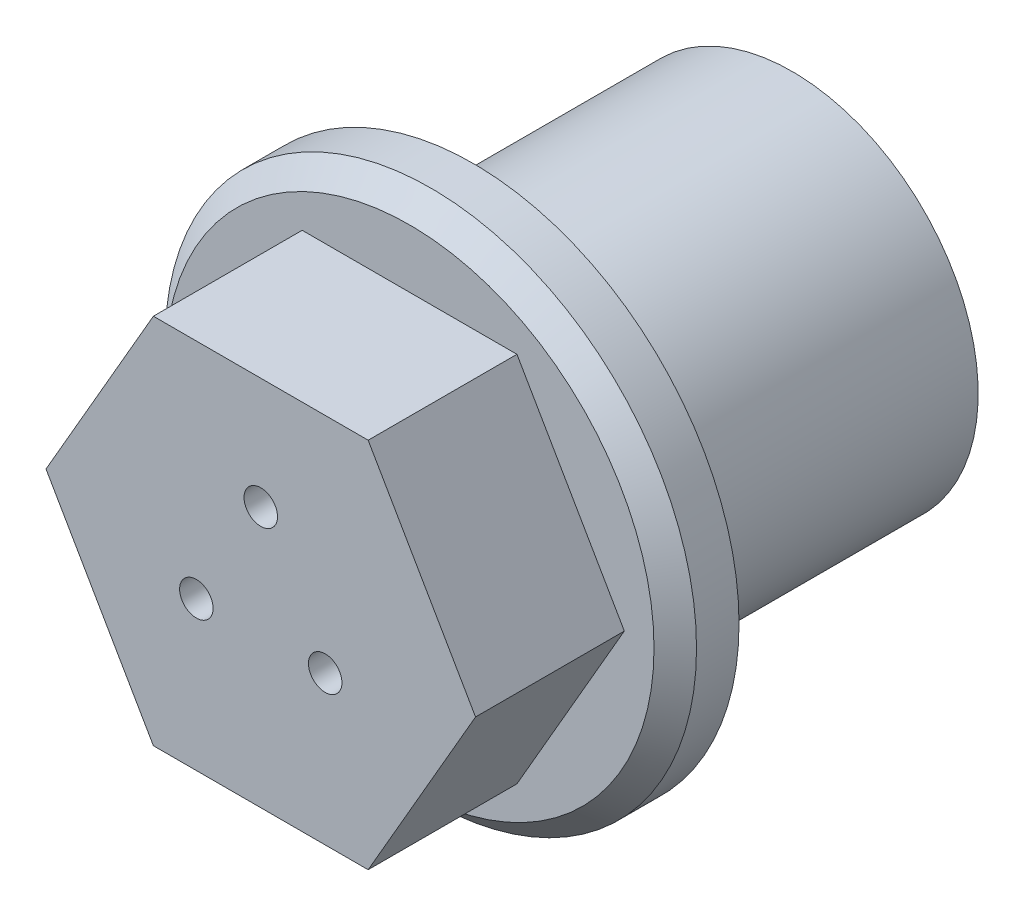
ISO-10303-21;
HEADER;
FILE_DESCRIPTION(('STEP AP214'),'2;1');
FILE_NAME('part.step','',(''),(''),'','','');
FILE_SCHEMA(('AUTOMOTIVE_DESIGN { 1 0 10303 214 1 1 1 1 }'));
ENDSEC;
DATA;
#1=APPLICATION_CONTEXT('core data for automotive mechanical design processes');
#2=APPLICATION_PROTOCOL_DEFINITION('international standard','automotive_design',2000,#1);
#3=PRODUCT_CONTEXT('',#1,'mechanical');
#4=PRODUCT('Part','Part','',(#3));
#5=PRODUCT_RELATED_PRODUCT_CATEGORY('part','',(#4));
#6=PRODUCT_DEFINITION_FORMATION('','',#4);
#7=PRODUCT_DEFINITION_CONTEXT('part definition',#1,'design');
#8=PRODUCT_DEFINITION('design','',#6,#7);
#9=PRODUCT_DEFINITION_SHAPE('','',#8);
#10=(LENGTH_UNIT() NAMED_UNIT(*) SI_UNIT(.MILLI.,.METRE.));
#11=(NAMED_UNIT(*) PLANE_ANGLE_UNIT() SI_UNIT($,.RADIAN.));
#12=(NAMED_UNIT(*) SI_UNIT($,.STERADIAN.) SOLID_ANGLE_UNIT());
#13=UNCERTAINTY_MEASURE_WITH_UNIT(LENGTH_MEASURE(1.E-05),#10,'distance_accuracy_value','');
#14=(GEOMETRIC_REPRESENTATION_CONTEXT(3) GLOBAL_UNCERTAINTY_ASSIGNED_CONTEXT((#13)) GLOBAL_UNIT_ASSIGNED_CONTEXT((#10,
#11,#12)) REPRESENTATION_CONTEXT('',''));
#15=CARTESIAN_POINT('',(0.,0.,0.));
#16=DIRECTION('',(0.,0.,1.));
#17=DIRECTION('',(1.,0.,0.));
#18=AXIS2_PLACEMENT_3D('',#15,#16,#17);
#19=CARTESIAN_POINT('',(0.,0.,31.75));
#20=DIRECTION('',(0.,0.,-1.));
#21=DIRECTION('',(-1.,0.,0.));
#22=AXIS2_PLACEMENT_3D('',#19,#20,#21);
#23=CYLINDRICAL_SURFACE('',#22,15.875);
#24=CARTESIAN_POINT('',(0.,0.,21.59));
#25=DIRECTION('',(0.,0.,1.));
#26=DIRECTION('',(1.,0.,0.));
#27=AXIS2_PLACEMENT_3D('',#24,#25,#26);
#28=CIRCLE('',#27,15.875);
#29=CARTESIAN_POINT('',(15.875,0.,21.59));
#30=VERTEX_POINT('',#29);
#31=EDGE_CURVE('E12',#30,#30,#28,.F.);
#32=ORIENTED_EDGE('',*,*,#31,.T.);
#33=EDGE_LOOP('',(#32));
#34=FACE_BOUND('',#33,.T.);
#35=CARTESIAN_POINT('',(0.,0.,19.05));
#36=DIRECTION('',(0.,0.,1.));
#37=DIRECTION('',(1.,0.,0.));
#38=AXIS2_PLACEMENT_3D('',#35,#36,#37);
#39=CIRCLE('',#38,15.875);
#40=CARTESIAN_POINT('',(15.875,0.,19.05));
#41=VERTEX_POINT('',#40);
#42=EDGE_CURVE('E205',#41,#41,#39,.T.);
#43=ORIENTED_EDGE('',*,*,#42,.T.);
#44=EDGE_LOOP('',(#43));
#45=FACE_BOUND('',#44,.T.);
#46=ADVANCED_FACE('F35',(#34,#45),#23,.T.);
#47=CARTESIAN_POINT('',(0.,0.,19.05));
#48=DIRECTION('',(0.,0.,-1.));
#49=DIRECTION('',(-1.,0.,0.));
#50=AXIS2_PLACEMENT_3D('',#47,#48,#49);
#51=CYLINDRICAL_SURFACE('',#50,11.1125);
#52=CARTESIAN_POINT('',(0.,0.,19.05));
#53=DIRECTION('',(0.,0.,1.));
#54=DIRECTION('',(1.,0.,0.));
#55=AXIS2_PLACEMENT_3D('',#52,#53,#54);
#56=CIRCLE('',#55,11.1125);
#57=CARTESIAN_POINT('',(-11.1125,0.,19.05));
#58=VERTEX_POINT('',#57);
#59=EDGE_CURVE('E220',#58,#58,#56,.T.);
#60=CARTESIAN_POINT('',(0.,0.,0.));
#61=DIRECTION('',(0.,0.,1.));
#62=DIRECTION('',(1.,0.,0.));
#63=AXIS2_PLACEMENT_3D('',#60,#61,#62);
#64=CIRCLE('',#63,11.1125);
#65=CARTESIAN_POINT('',(-11.1125,0.,0.));
#66=VERTEX_POINT('',#65);
#67=EDGE_CURVE('E219',#66,#66,#64,.T.);
#68=CARTESIAN_POINT('',(-11.1125,0.,19.05));
#69=CARTESIAN_POINT('',(-11.1125,0.,18.8515625));
#70=CARTESIAN_POINT('',(-11.1125,0.,18.653125));
#71=CARTESIAN_POINT('',(-11.1125,0.,18.25625));
#72=CARTESIAN_POINT('',(-11.1125,0.,18.0578125));
#73=CARTESIAN_POINT('',(-11.1125,0.,17.6609375));
#74=CARTESIAN_POINT('',(-11.1125,0.,17.4625));
#75=CARTESIAN_POINT('',(-11.1125,0.,17.065625));
#76=CARTESIAN_POINT('',(-11.1125,0.,16.8671875));
#77=CARTESIAN_POINT('',(-11.1125,0.,16.4703125));
#78=CARTESIAN_POINT('',(-11.1125,0.,16.271875));
#79=CARTESIAN_POINT('',(-11.1125,0.,15.875));
#80=CARTESIAN_POINT('',(-11.1125,0.,15.6765625));
#81=CARTESIAN_POINT('',(-11.1125,0.,15.2796875));
#82=CARTESIAN_POINT('',(-11.1125,0.,15.08125));
#83=CARTESIAN_POINT('',(-11.1125,0.,14.684375));
#84=CARTESIAN_POINT('',(-11.1125,0.,14.4859375));
#85=CARTESIAN_POINT('',(-11.1125,0.,14.0890625));
#86=CARTESIAN_POINT('',(-11.1125,0.,13.890625));
#87=CARTESIAN_POINT('',(-11.1125,0.,13.49375));
#88=CARTESIAN_POINT('',(-11.1125,0.,13.2953125));
#89=CARTESIAN_POINT('',(-11.1125,0.,12.8984375));
#90=CARTESIAN_POINT('',(-11.1125,0.,12.7));
#91=CARTESIAN_POINT('',(-11.1125,0.,12.303125));
#92=CARTESIAN_POINT('',(-11.1125,0.,12.1046875));
#93=CARTESIAN_POINT('',(-11.1125,0.,11.7078125));
#94=CARTESIAN_POINT('',(-11.1125,0.,11.509375));
#95=CARTESIAN_POINT('',(-11.1125,0.,11.1125));
#96=CARTESIAN_POINT('',(-11.1125,0.,10.9140625));
#97=CARTESIAN_POINT('',(-11.1125,0.,10.5171875));
#98=CARTESIAN_POINT('',(-11.1125,0.,10.31875));
#99=CARTESIAN_POINT('',(-11.1125,0.,9.921875));
#100=CARTESIAN_POINT('',(-11.1125,0.,9.7234375));
#101=CARTESIAN_POINT('',(-11.1125,0.,9.3265625));
#102=CARTESIAN_POINT('',(-11.1125,0.,9.128125));
#103=CARTESIAN_POINT('',(-11.1125,0.,8.73125));
#104=CARTESIAN_POINT('',(-11.1125,0.,8.5328125));
#105=CARTESIAN_POINT('',(-11.1125,0.,8.1359375));
#106=CARTESIAN_POINT('',(-11.1125,0.,7.9375));
#107=CARTESIAN_POINT('',(-11.1125,0.,7.540625));
#108=CARTESIAN_POINT('',(-11.1125,0.,7.3421875));
#109=CARTESIAN_POINT('',(-11.1125,0.,6.9453125));
#110=CARTESIAN_POINT('',(-11.1125,0.,6.746875));
#111=CARTESIAN_POINT('',(-11.1125,0.,6.35));
#112=CARTESIAN_POINT('',(-11.1125,0.,6.1515625));
#113=CARTESIAN_POINT('',(-11.1125,0.,5.7546875));
#114=CARTESIAN_POINT('',(-11.1125,0.,5.55625));
#115=CARTESIAN_POINT('',(-11.1125,0.,5.159375));
#116=CARTESIAN_POINT('',(-11.1125,0.,4.9609375));
#117=CARTESIAN_POINT('',(-11.1125,0.,4.5640625));
#118=CARTESIAN_POINT('',(-11.1125,0.,4.365625));
#119=CARTESIAN_POINT('',(-11.1125,0.,3.96875));
#120=CARTESIAN_POINT('',(-11.1125,0.,3.7703125));
#121=CARTESIAN_POINT('',(-11.1125,0.,3.3734375));
#122=CARTESIAN_POINT('',(-11.1125,0.,3.175));
#123=CARTESIAN_POINT('',(-11.1125,0.,2.778125));
#124=CARTESIAN_POINT('',(-11.1125,0.,2.5796875));
#125=CARTESIAN_POINT('',(-11.1125,0.,2.1828125));
#126=CARTESIAN_POINT('',(-11.1125,0.,1.984375));
#127=CARTESIAN_POINT('',(-11.1125,0.,1.5875));
#128=CARTESIAN_POINT('',(-11.1125,0.,1.3890625));
#129=CARTESIAN_POINT('',(-11.1125,0.,0.992187500000001));
#130=CARTESIAN_POINT('',(-11.1125,0.,0.793750000000001));
#131=CARTESIAN_POINT('',(-11.1125,0.,0.396875));
#132=CARTESIAN_POINT('',(-11.1125,0.,0.1984375));
#133=CARTESIAN_POINT('',(-11.1125,0.,0.));
#134=B_SPLINE_CURVE_WITH_KNOTS('',3,(#68,#69,#70,#71,#72,#73,#74,#75,#76,#77,#78,#79,#80,#81,
#82,#83,#84,#85,#86,#87,#88,#89,#90,#91,#92,#93,#94,#95,#96,#97,#98,#99,#100,#101,#102,#103,
#104,#105,#106,#107,#108,#109,#110,#111,#112,#113,#114,#115,#116,#117,#118,#119,#120,#121,#122,
#123,#124,#125,#126,#127,#128,#129,#130,#131,#132,#133),.UNSPECIFIED.,.F.,.F.,(4,2,2,2,2,2,2,2,
2,2,2,2,2,2,2,2,2,2,2,2,2,2,2,2,2,2,2,2,2,2,2,2,4),(0.,0.5953125,1.190625,1.7859375,2.38125,
2.9765625,3.571875,4.1671875,4.7625,5.3578125,5.953125,6.5484375,7.14375,7.7390625,8.334375,
8.9296875,9.525,10.1203125,10.715625,11.3109375,11.90625,12.5015625,13.096875,13.6921875,
14.2875,14.8828125,15.478125,16.0734375,16.66875,17.2640625,17.859375,18.4546875,19.05),.UNSPECIFIED.);
#135=EDGE_CURVE('BSEAM242',#58,#66,#134,.T.);
#136=ORIENTED_EDGE('',*,*,#59,.F.);
#137=ORIENTED_EDGE('',*,*,#67,.T.);
#138=ORIENTED_EDGE('',*,*,#135,.T.);
#139=ORIENTED_EDGE('',*,*,#135,.F.);
#140=EDGE_LOOP('',(#136,#138,#137,#139));
#141=FACE_BOUND('',#140,.T.);
#142=ADVANCED_FACE('F242',(#141),#51,.T.);
#143=CARTESIAN_POINT('',(0.,0.,0.));
#144=DIRECTION('',(0.,0.,1.));
#145=DIRECTION('',(1.,0.,0.));
#146=AXIS2_PLACEMENT_3D('',#143,#144,#145);
#147=PLANE('',#146);
#148=CARTESIAN_POINT('',(0.,0.,0.));
#149=DIRECTION('',(0.,0.,-1.));
#150=DIRECTION('',(-1.,0.,0.));
#151=AXIS2_PLACEMENT_3D('',#148,#149,#150);
#152=CIRCLE('',#151,9.5504);
#153=CARTESIAN_POINT('',(-9.5504,0.,0.));
#154=VERTEX_POINT('',#153);
#155=EDGE_CURVE('E106',#154,#154,#152,.T.);
#156=ORIENTED_EDGE('',*,*,#155,.F.);
#157=EDGE_LOOP('',(#156));
#158=FACE_BOUND('',#157,.T.);
#159=ORIENTED_EDGE('',*,*,#67,.F.);
#160=EDGE_LOOP('',(#159));
#161=FACE_BOUND('',#160,.T.);
#162=ADVANCED_FACE('F248',(#158,#161),#147,.F.);
#163=CARTESIAN_POINT('',(0.,0.,19.05));
#164=DIRECTION('',(0.,0.,1.));
#165=DIRECTION('',(1.,0.,0.));
#166=AXIS2_PLACEMENT_3D('',#163,#164,#165);
#167=PLANE('',#166);
#168=ORIENTED_EDGE('',*,*,#59,.T.);
#169=EDGE_LOOP('',(#168));
#170=FACE_BOUND('',#169,.T.);
#171=ORIENTED_EDGE('',*,*,#42,.F.);
#172=EDGE_LOOP('',(#171));
#173=FACE_BOUND('',#172,.T.);
#174=ADVANCED_FACE('F253',(#170,#173),#167,.F.);
#175=CARTESIAN_POINT('',(0.,0.,22.86));
#176=DIRECTION('',(0.,0.,1.));
#177=DIRECTION('',(1.,0.,0.));
#178=AXIS2_PLACEMENT_3D('',#175,#176,#177);
#179=PLANE('',#178);
#180=CARTESIAN_POINT('',(0.,0.,22.86));
#181=DIRECTION('',(0.,0.,1.));
#182=DIRECTION('',(1.,0.,0.));
#183=AXIS2_PLACEMENT_3D('',#180,#181,#182);
#184=CIRCLE('',#183,14.605);
#185=CARTESIAN_POINT('',(14.605,0.,22.86));
#186=VERTEX_POINT('',#185);
#187=EDGE_CURVE('E46',#186,#186,#184,.T.);
#188=ORIENTED_EDGE('',*,*,#187,.T.);
#189=EDGE_LOOP('',(#188));
#190=FACE_BOUND('',#189,.T.);
#191=DIRECTION('',(1.,0.,0.));
#192=VECTOR('',#191,1.);
#193=CARTESIAN_POINT('',(-6.41580486636972,-11.1125,22.86));
#194=LINE('',#193,#192);
#195=CARTESIAN_POINT('',(-6.41580486636972,-11.1125,22.86));
#196=VERTEX_POINT('',#195);
#197=CARTESIAN_POINT('',(6.41580486636972,-11.1125,22.86));
#198=VERTEX_POINT('',#197);
#199=EDGE_CURVE('E190',#196,#198,#194,.T.);
#200=ORIENTED_EDGE('',*,*,#199,.F.);
#201=DIRECTION('',(0.5,-0.866025403784439,0.));
#202=VECTOR('',#201,1.);
#203=CARTESIAN_POINT('',(-12.8316097327394,0.,22.86));
#204=LINE('',#203,#202);
#205=CARTESIAN_POINT('',(-12.8316097327394,0.,22.86));
#206=VERTEX_POINT('',#205);
#207=EDGE_CURVE('E305',#206,#196,#204,.T.);
#208=ORIENTED_EDGE('',*,*,#207,.F.);
#209=DIRECTION('',(-0.5,-0.866025403784439,0.));
#210=VECTOR('',#209,1.);
#211=CARTESIAN_POINT('',(-6.41580486636972,11.1125,22.86));
#212=LINE('',#211,#210);
#213=CARTESIAN_POINT('',(-6.41580486636972,11.1125,22.86));
#214=VERTEX_POINT('',#213);
#215=EDGE_CURVE('E303',#214,#206,#212,.T.);
#216=ORIENTED_EDGE('',*,*,#215,.F.);
#217=DIRECTION('',(-1.,0.,0.));
#218=VECTOR('',#217,1.);
#219=CARTESIAN_POINT('',(6.41580486636971,11.1125,22.86));
#220=LINE('',#219,#218);
#221=CARTESIAN_POINT('',(6.41580486636971,11.1125,22.86));
#222=VERTEX_POINT('',#221);
#223=EDGE_CURVE('E306',#222,#214,#220,.T.);
#224=ORIENTED_EDGE('',*,*,#223,.F.);
#225=DIRECTION('',(-0.5,0.866025403784438,0.));
#226=VECTOR('',#225,1.);
#227=CARTESIAN_POINT('',(12.8316097327394,0.,22.86));
#228=LINE('',#227,#226);
#229=CARTESIAN_POINT('',(12.8316097327394,0.,22.86));
#230=VERTEX_POINT('',#229);
#231=EDGE_CURVE('E308',#230,#222,#228,.T.);
#232=ORIENTED_EDGE('',*,*,#231,.F.);
#233=DIRECTION('',(0.5,0.866025403784439,0.));
#234=VECTOR('',#233,1.);
#235=CARTESIAN_POINT('',(6.41580486636972,-11.1125,22.86));
#236=LINE('',#235,#234);
#237=EDGE_CURVE('E173',#198,#230,#236,.T.);
#238=ORIENTED_EDGE('',*,*,#237,.F.);
#239=EDGE_LOOP('',(#200,#208,#216,#224,#232,#238));
#240=FACE_BOUND('',#239,.T.);
#241=ADVANCED_FACE('F228',(#190,#240),#179,.T.);
#242=CARTESIAN_POINT('',(6.41580486636972,-11.1125,22.86));
#243=DIRECTION('',(0.866025403784439,-0.5,0.));
#244=DIRECTION('',(0.5,0.866025403784439,0.));
#245=AXIS2_PLACEMENT_3D('',#242,#243,#244);
#246=PLANE('',#245);
#247=DIRECTION('',(0.5,0.866025403784439,0.));
#248=VECTOR('',#247,1.);
#249=CARTESIAN_POINT('',(6.41580486636972,-11.1125,31.75));
#250=LINE('',#249,#248);
#251=CARTESIAN_POINT('',(6.41580486636972,-11.1125,31.75));
#252=VERTEX_POINT('',#251);
#253=CARTESIAN_POINT('',(12.8316097327394,0.,31.75));
#254=VERTEX_POINT('',#253);
#255=EDGE_CURVE('E179',#252,#254,#250,.T.);
#256=ORIENTED_EDGE('',*,*,#255,.F.);
#257=DIRECTION('',(0.,0.,1.));
#258=VECTOR('',#257,1.);
#259=CARTESIAN_POINT('',(6.41580486636972,-11.1125,22.86));
#260=LINE('',#259,#258);
#261=EDGE_CURVE('E203',#198,#252,#260,.T.);
#262=ORIENTED_EDGE('',*,*,#261,.F.);
#263=ORIENTED_EDGE('',*,*,#237,.T.);
#264=DIRECTION('',(0.,0.,1.));
#265=VECTOR('',#264,1.);
#266=CARTESIAN_POINT('',(12.8316097327394,0.,22.86));
#267=LINE('',#266,#265);
#268=EDGE_CURVE('E215',#230,#254,#267,.T.);
#269=ORIENTED_EDGE('',*,*,#268,.T.);
#270=EDGE_LOOP('',(#256,#262,#263,#269));
#271=FACE_BOUND('',#270,.T.);
#272=ADVANCED_FACE('F268',(#271),#246,.T.);
#273=CARTESIAN_POINT('',(-6.41580486636972,-11.1125,22.86));
#274=DIRECTION('',(0.,-1.,0.));
#275=DIRECTION('',(1.,0.,0.));
#276=AXIS2_PLACEMENT_3D('',#273,#274,#275);
#277=PLANE('',#276);
#278=DIRECTION('',(1.,0.,0.));
#279=VECTOR('',#278,1.);
#280=CARTESIAN_POINT('',(-6.41580486636972,-11.1125,31.75));
#281=LINE('',#280,#279);
#282=CARTESIAN_POINT('',(-6.41580486636972,-11.1125,31.75));
#283=VERTEX_POINT('',#282);
#284=EDGE_CURVE('E201',#283,#252,#281,.T.);
#285=ORIENTED_EDGE('',*,*,#284,.F.);
#286=DIRECTION('',(0.,0.,1.));
#287=VECTOR('',#286,1.);
#288=CARTESIAN_POINT('',(-6.41580486636972,-11.1125,22.86));
#289=LINE('',#288,#287);
#290=EDGE_CURVE('E206',#196,#283,#289,.T.);
#291=ORIENTED_EDGE('',*,*,#290,.F.);
#292=ORIENTED_EDGE('',*,*,#199,.T.);
#293=ORIENTED_EDGE('',*,*,#261,.T.);
#294=EDGE_LOOP('',(#285,#291,#292,#293));
#295=FACE_BOUND('',#294,.T.);
#296=ADVANCED_FACE('F159',(#295),#277,.T.);
#297=CARTESIAN_POINT('',(-12.8316097327394,0.,22.86));
#298=DIRECTION('',(-0.866025403784439,-0.5,0.));
#299=DIRECTION('',(0.5,-0.866025403784439,0.));
#300=AXIS2_PLACEMENT_3D('',#297,#298,#299);
#301=PLANE('',#300);
#302=DIRECTION('',(0.5,-0.866025403784439,0.));
#303=VECTOR('',#302,1.);
#304=CARTESIAN_POINT('',(-12.8316097327394,0.,31.75));
#305=LINE('',#304,#303);
#306=CARTESIAN_POINT('',(-12.8316097327394,0.,31.75));
#307=VERTEX_POINT('',#306);
#308=EDGE_CURVE('E198',#307,#283,#305,.T.);
#309=ORIENTED_EDGE('',*,*,#308,.F.);
#310=DIRECTION('',(0.,0.,1.));
#311=VECTOR('',#310,1.);
#312=CARTESIAN_POINT('',(-12.8316097327394,0.,22.86));
#313=LINE('',#312,#311);
#314=EDGE_CURVE('E208',#206,#307,#313,.T.);
#315=ORIENTED_EDGE('',*,*,#314,.F.);
#316=ORIENTED_EDGE('',*,*,#207,.T.);
#317=ORIENTED_EDGE('',*,*,#290,.T.);
#318=EDGE_LOOP('',(#309,#315,#316,#317));
#319=FACE_BOUND('',#318,.T.);
#320=ADVANCED_FACE('F288',(#319),#301,.T.);
#321=CARTESIAN_POINT('',(-6.41580486636972,11.1125,22.86));
#322=DIRECTION('',(-0.866025403784439,0.5,0.));
#323=DIRECTION('',(-0.5,-0.866025403784439,0.));
#324=AXIS2_PLACEMENT_3D('',#321,#322,#323);
#325=PLANE('',#324);
#326=DIRECTION('',(-0.5,-0.866025403784439,0.));
#327=VECTOR('',#326,1.);
#328=CARTESIAN_POINT('',(-6.41580486636972,11.1125,31.75));
#329=LINE('',#328,#327);
#330=CARTESIAN_POINT('',(-6.41580486636972,11.1125,31.75));
#331=VERTEX_POINT('',#330);
#332=EDGE_CURVE('E195',#331,#307,#329,.T.);
#333=ORIENTED_EDGE('',*,*,#332,.F.);
#334=DIRECTION('',(0.,0.,1.));
#335=VECTOR('',#334,1.);
#336=CARTESIAN_POINT('',(-6.41580486636972,11.1125,22.86));
#337=LINE('',#336,#335);
#338=EDGE_CURVE('E210',#214,#331,#337,.T.);
#339=ORIENTED_EDGE('',*,*,#338,.F.);
#340=ORIENTED_EDGE('',*,*,#215,.T.);
#341=ORIENTED_EDGE('',*,*,#314,.T.);
#342=EDGE_LOOP('',(#333,#339,#340,#341));
#343=FACE_BOUND('',#342,.T.);
#344=ADVANCED_FACE('F285',(#343),#325,.T.);
#345=CARTESIAN_POINT('',(6.41580486636971,11.1125,22.86));
#346=DIRECTION('',(0.,1.,0.));
#347=DIRECTION('',(0.,0.,1.));
#348=AXIS2_PLACEMENT_3D('',#345,#346,#347);
#349=PLANE('',#348);
#350=DIRECTION('',(-1.,0.,0.));
#351=VECTOR('',#350,1.);
#352=CARTESIAN_POINT('',(6.41580486636971,11.1125,31.75));
#353=LINE('',#352,#351);
#354=CARTESIAN_POINT('',(6.41580486636971,11.1125,31.75));
#355=VERTEX_POINT('',#354);
#356=EDGE_CURVE('E187',#355,#331,#353,.T.);
#357=ORIENTED_EDGE('',*,*,#356,.F.);
#358=DIRECTION('',(0.,0.,1.));
#359=VECTOR('',#358,1.);
#360=CARTESIAN_POINT('',(6.41580486636971,11.1125,22.86));
#361=LINE('',#360,#359);
#362=EDGE_CURVE('E212',#222,#355,#361,.T.);
#363=ORIENTED_EDGE('',*,*,#362,.F.);
#364=ORIENTED_EDGE('',*,*,#223,.T.);
#365=ORIENTED_EDGE('',*,*,#338,.T.);
#366=EDGE_LOOP('',(#357,#363,#364,#365));
#367=FACE_BOUND('',#366,.T.);
#368=ADVANCED_FACE('F281',(#367),#349,.T.);
#369=CARTESIAN_POINT('',(12.8316097327394,0.,22.86));
#370=DIRECTION('',(0.866025403784438,0.5,0.));
#371=DIRECTION('',(-0.5,0.866025403784439,0.));
#372=AXIS2_PLACEMENT_3D('',#369,#370,#371);
#373=PLANE('',#372);
#374=DIRECTION('',(-0.5,0.866025403784438,0.));
#375=VECTOR('',#374,1.);
#376=CARTESIAN_POINT('',(12.8316097327394,0.,31.75));
#377=LINE('',#376,#375);
#378=EDGE_CURVE('E181',#254,#355,#377,.T.);
#379=ORIENTED_EDGE('',*,*,#378,.F.);
#380=ORIENTED_EDGE('',*,*,#268,.F.);
#381=ORIENTED_EDGE('',*,*,#231,.T.);
#382=ORIENTED_EDGE('',*,*,#362,.T.);
#383=EDGE_LOOP('',(#379,#380,#381,#382));
#384=FACE_BOUND('',#383,.T.);
#385=ADVANCED_FACE('F237',(#384),#373,.T.);
#386=CARTESIAN_POINT('',(0.,0.,31.75));
#387=DIRECTION('',(0.,0.,1.));
#388=DIRECTION('',(1.,0.,0.));
#389=AXIS2_PLACEMENT_3D('',#386,#387,#388);
#390=PLANE('',#389);
#391=CARTESIAN_POINT('',(0.,4.445,31.75));
#392=DIRECTION('',(0.,0.,1.));
#393=DIRECTION('',(1.,0.,0.));
#394=AXIS2_PLACEMENT_3D('',#391,#392,#393);
#395=CIRCLE('',#394,1.);
#396=CARTESIAN_POINT('',(1.,4.445,31.75));
#397=VERTEX_POINT('',#396);
#398=EDGE_CURVE('E107',#397,#397,#395,.T.);
#399=ORIENTED_EDGE('',*,*,#398,.F.);
#400=EDGE_LOOP('',(#399));
#401=FACE_BOUND('',#400,.T.);
#402=CARTESIAN_POINT('',(3.84948291982211,-2.22249999999983,31.75));
#403=DIRECTION('',(0.,0.,1.));
#404=DIRECTION('',(1.,0.,0.));
#405=AXIS2_PLACEMENT_3D('',#402,#403,#404);
#406=CIRCLE('',#405,1.00000000000024);
#407=CARTESIAN_POINT('',(4.84948291982236,-2.22249999999983,31.75));
#408=VERTEX_POINT('',#407);
#409=EDGE_CURVE('E396',#408,#408,#406,.T.);
#410=ORIENTED_EDGE('',*,*,#409,.F.);
#411=EDGE_LOOP('',(#410));
#412=FACE_BOUND('',#411,.T.);
#413=CARTESIAN_POINT('',(-3.84948291982154,-2.22250000000017,31.75));
#414=DIRECTION('',(0.,0.,1.));
#415=DIRECTION('',(1.,0.,0.));
#416=AXIS2_PLACEMENT_3D('',#413,#414,#415);
#417=CIRCLE('',#416,1.00000000000036);
#418=CARTESIAN_POINT('',(-2.84948291982119,-2.22250000000017,31.75));
#419=VERTEX_POINT('',#418);
#420=EDGE_CURVE('E402',#419,#419,#417,.T.);
#421=ORIENTED_EDGE('',*,*,#420,.F.);
#422=EDGE_LOOP('',(#421));
#423=FACE_BOUND('',#422,.T.);
#424=ORIENTED_EDGE('',*,*,#284,.T.);
#425=ORIENTED_EDGE('',*,*,#255,.T.);
#426=ORIENTED_EDGE('',*,*,#378,.T.);
#427=ORIENTED_EDGE('',*,*,#356,.T.);
#428=ORIENTED_EDGE('',*,*,#332,.T.);
#429=ORIENTED_EDGE('',*,*,#308,.T.);
#430=EDGE_LOOP('',(#424,#425,#426,#427,#428,#429));
#431=FACE_BOUND('',#430,.T.);
#432=ADVANCED_FACE('F232',(#401,#412,#423,#431),#390,.T.);
#433=CARTESIAN_POINT('',(0.,0.,22.86));
#434=DIRECTION('',(0.,0.,-1.));
#435=DIRECTION('',(-1.,0.,0.));
#436=AXIS2_PLACEMENT_3D('',#433,#434,#435);
#437=CONICAL_SURFACE('',#436,14.605,0.785398163397448);
#438=ORIENTED_EDGE('',*,*,#31,.F.);
#439=EDGE_LOOP('',(#438));
#440=FACE_BOUND('',#439,.T.);
#441=ORIENTED_EDGE('',*,*,#187,.F.);
#442=EDGE_LOOP('',(#441));
#443=FACE_BOUND('',#442,.T.);
#444=ADVANCED_FACE('F37',(#440,#443),#437,.T.);
#445=CARTESIAN_POINT('',(0.,0.,22.86));
#446=DIRECTION('',(0.,0.,1.));
#447=DIRECTION('',(1.,0.,0.));
#448=AXIS2_PLACEMENT_3D('',#445,#446,#447);
#449=PLANE('',#448);
#450=CARTESIAN_POINT('',(0.,4.445,22.86));
#451=DIRECTION('',(0.,0.,1.));
#452=DIRECTION('',(1.,0.,0.));
#453=AXIS2_PLACEMENT_3D('',#450,#451,#452);
#454=CIRCLE('',#453,1.);
#455=CARTESIAN_POINT('',(0.000123497343628788,5.44499999236823,22.86));
#456=VERTEX_POINT('',#455);
#457=CARTESIAN_POINT('',(0.,5.445,22.86));
#458=VERTEX_POINT('',#457);
#459=EDGE_CURVE('E100',#456,#458,#454,.F.);
#460=ORIENTED_EDGE('',*,*,#459,.F.);
#461=CARTESIAN_POINT('',(0.,0.,22.86));
#462=DIRECTION('',(0.,0.,1.));
#463=DIRECTION('',(1.,0.,0.));
#464=AXIS2_PLACEMENT_3D('',#461,#462,#463);
#465=CIRCLE('',#464,5.445);
#466=CARTESIAN_POINT('',(4.71552357610018,-2.72247266870399,22.86));
#467=VERTEX_POINT('',#466);
#468=EDGE_CURVE('E119',#467,#456,#465,.T.);
#469=ORIENTED_EDGE('',*,*,#468,.F.);
#470=CARTESIAN_POINT('',(3.84948291982211,-2.22249999999983,22.86));
#471=DIRECTION('',(0.,0.,1.));
#472=DIRECTION('',(1.,0.,0.));
#473=AXIS2_PLACEMENT_3D('',#470,#471,#472);
#474=CIRCLE('',#473,1.00000000000024);
#475=EDGE_CURVE('E59',#467,#467,#474,.F.);
#476=ORIENTED_EDGE('',*,*,#475,.F.);
#477=CARTESIAN_POINT('',(-4.71550300743985,-2.72251631265119,22.86));
#478=VERTEX_POINT('',#477);
#479=EDGE_CURVE('E177',#478,#467,#465,.T.);
#480=ORIENTED_EDGE('',*,*,#479,.F.);
#481=CARTESIAN_POINT('',(-3.84948291982154,-2.22250000000017,22.86));
#482=DIRECTION('',(0.,0.,1.));
#483=DIRECTION('',(1.,0.,0.));
#484=AXIS2_PLACEMENT_3D('',#481,#482,#483);
#485=CIRCLE('',#484,1.00000000000036);
#486=EDGE_CURVE('E115',#478,#478,#485,.F.);
#487=ORIENTED_EDGE('',*,*,#486,.F.);
#488=EDGE_CURVE('E111',#458,#478,#465,.T.);
#489=ORIENTED_EDGE('',*,*,#488,.F.);
#490=EDGE_LOOP('',(#460,#469,#476,#480,#487,#489));
#491=FACE_BOUND('',#490,.T.);
#492=ADVANCED_FACE('F113',(#491),#449,.F.);
#493=CARTESIAN_POINT('',(2.35183173975593,9.25629664757329,0.));
#494=CARTESIAN_POINT('',(2.64410942475608,4.75990654844358,22.86));
#495=CARTESIAN_POINT('',(-16.1607615553907,13.9599601270852,0.));
#496=CARTESIAN_POINT('',(-6.87570367213108,10.0481253979557,22.86));
#497=CARTESIAN_POINT('',(-20.8644250349025,-4.55263316806144,0.));
#498=CARTESIAN_POINT('',(-12.1639225216432,0.528312301068575,22.86));
#499=CARTESIAN_POINT('',(-2.35183173975593,-9.25629664757329,0.));
#500=CARTESIAN_POINT('',(-2.64410942475608,-4.75990654844358,22.86));
#501=CARTESIAN_POINT('',(16.1607615553906,-13.9599601270851,0.));
#502=CARTESIAN_POINT('',(6.87570367213108,-10.0481253979557,22.86));
#503=CARTESIAN_POINT('',(20.8644250349025,4.55263316806143,0.));
#504=CARTESIAN_POINT('',(12.1639225216432,-0.528312301068574,22.86));
#505=CARTESIAN_POINT('',(2.35183173975593,9.25629664757329,0.));
#506=CARTESIAN_POINT('',(2.64410942475608,4.75990654844358,22.86));
#507=(BOUNDED_SURFACE() B_SPLINE_SURFACE(3,1,((#493,#494),(#495,#496),(#497,#498),(#499,#500),
(#501,#502),(#503,#504),(#505,#506)),.UNSPECIFIED.,.T.,.F.,.F.) B_SPLINE_SURFACE_WITH_KNOTS((4,
3,4),(2,2),(0.,0.5,1.),(0.,1.),
.UNSPECIFIED.) GEOMETRIC_REPRESENTATION_ITEM() RATIONAL_B_SPLINE_SURFACE(((1.,1.),
(0.333333333333333,0.333333333333333),(0.333333333333333,0.333333333333333),(1.,1.),
(0.333333333333334,0.333333333333333),(0.333333333333334,0.333333333333333),(1.,1.))) REPRESENTATION_ITEM('') SURFACE());
#508=CARTESIAN_POINT('',(2.64410942475608,4.7599065484436,22.8599999999999));
#509=CARTESIAN_POINT('',(-6.87570367213111,10.0481253979557,22.8599999999999));
#510=CARTESIAN_POINT('',(-12.1639225216433,0.528312301068558,22.8599999999999));
#511=CARTESIAN_POINT('',(-2.64410942475608,-4.7599065484436,22.8599999999999));
#512=CARTESIAN_POINT('',(6.87570367213111,-10.0481253979557,22.8599999999999));
#513=CARTESIAN_POINT('',(12.1639225216433,-0.528312301068557,22.8599999999999));
#514=CARTESIAN_POINT('',(2.64410942475608,4.7599065484436,22.8599999999999));
#515=(BOUNDED_CURVE() B_SPLINE_CURVE(3,(#508,#509,#510,#511,#512,#513,#514),.UNSPECIFIED.,.T.,
.F.) B_SPLINE_CURVE_WITH_KNOTS((4,3,4),(0.,0.5,1.),
.UNSPECIFIED.) CURVE() GEOMETRIC_REPRESENTATION_ITEM() RATIONAL_B_SPLINE_CURVE((1.,
0.333333333333333,0.333333333333333,1.,0.333333333333333,0.333333333333333,1.)) REPRESENTATION_ITEM(''));
#516=EDGE_CURVE('E53',#456,#458,#515,.T.);
#517=ORIENTED_EDGE('',*,*,#155,.T.);
#518=EDGE_LOOP('',(#517));
#519=FACE_BOUND('',#518,.T.);
#520=ORIENTED_EDGE('',*,*,#479,.T.);
#521=ORIENTED_EDGE('',*,*,#468,.T.);
#522=ORIENTED_EDGE('',*,*,#516,.T.);
#523=ORIENTED_EDGE('',*,*,#488,.T.);
#524=EDGE_LOOP('',(#520,#521,#522,#523));
#525=FACE_BOUND('',#524,.T.);
#526=ADVANCED_FACE('F124',(#519,#525),#507,.F.);
#527=CARTESIAN_POINT('',(-3.84948291982154,-2.22250000000017,-0.00101999999999741));
#528=DIRECTION('',(0.,0.,1.));
#529=DIRECTION('',(1.,0.,0.));
#530=AXIS2_PLACEMENT_3D('',#527,#528,#529);
#531=CYLINDRICAL_SURFACE('',#530,1.00000000000036);
#532=ORIENTED_EDGE('',*,*,#420,.T.);
#533=EDGE_LOOP('',(#532));
#534=FACE_BOUND('',#533,.T.);
#535=ORIENTED_EDGE('',*,*,#486,.T.);
#536=EDGE_LOOP('',(#535));
#537=FACE_BOUND('',#536,.T.);
#538=ADVANCED_FACE('F148',(#534,#537),#531,.F.);
#539=CARTESIAN_POINT('',(3.84948291982211,-2.22249999999983,-0.00101999999999741));
#540=DIRECTION('',(0.,0.,1.));
#541=DIRECTION('',(1.,0.,0.));
#542=AXIS2_PLACEMENT_3D('',#539,#540,#541);
#543=CYLINDRICAL_SURFACE('',#542,1.00000000000024);
#544=ORIENTED_EDGE('',*,*,#409,.T.);
#545=EDGE_LOOP('',(#544));
#546=FACE_BOUND('',#545,.T.);
#547=ORIENTED_EDGE('',*,*,#475,.T.);
#548=EDGE_LOOP('',(#547));
#549=FACE_BOUND('',#548,.T.);
#550=ADVANCED_FACE('F369',(#546,#549),#543,.F.);
#551=CARTESIAN_POINT('',(0.,4.445,-0.00101999999999741));
#552=DIRECTION('',(0.,0.,1.));
#553=DIRECTION('',(1.,0.,0.));
#554=AXIS2_PLACEMENT_3D('',#551,#552,#553);
#555=CYLINDRICAL_SURFACE('',#554,1.);
#556=ORIENTED_EDGE('',*,*,#398,.T.);
#557=EDGE_LOOP('',(#556));
#558=FACE_BOUND('',#557,.T.);
#559=ORIENTED_EDGE('',*,*,#516,.F.);
#560=ORIENTED_EDGE('',*,*,#459,.T.);
#561=EDGE_LOOP('',(#559,#560));
#562=FACE_BOUND('',#561,.T.);
#563=ADVANCED_FACE('F102',(#558,#562),#555,.F.);
#564=CLOSED_SHELL('',(#46,#142,#162,#174,#241,#272,#296,#320,#344,#368,#385,#432,#444,#492,#526,
#538,#550,#563));
#565=MANIFOLD_SOLID_BREP('B2',#564);
#566=ADVANCED_BREP_SHAPE_REPRESENTATION('',(#18,#565),#14);
#567=SHAPE_DEFINITION_REPRESENTATION(#9,#566);
ENDSEC;
END-ISO-10303-21;
